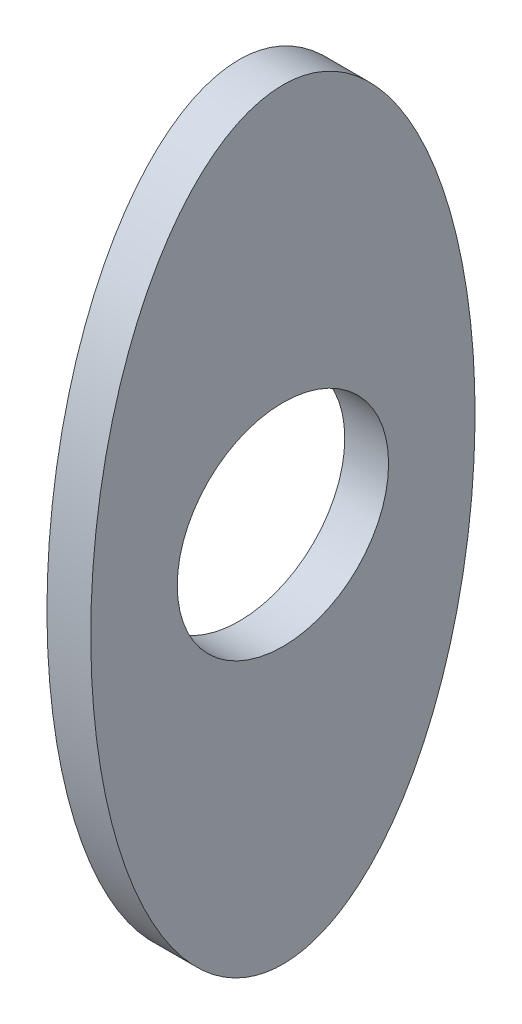
ISO-10303-21;
HEADER;
FILE_DESCRIPTION(('STEP AP214'),'2;1');
FILE_NAME('part.step','',(''),(''),'','','');
FILE_SCHEMA(('AUTOMOTIVE_DESIGN { 1 0 10303 214 1 1 1 1 }'));
ENDSEC;
DATA;
#1=APPLICATION_CONTEXT('core data for automotive mechanical design processes');
#2=APPLICATION_PROTOCOL_DEFINITION('international standard','automotive_design',2000,#1);
#3=PRODUCT_CONTEXT('',#1,'mechanical');
#4=PRODUCT('Part','Part','',(#3));
#5=PRODUCT_RELATED_PRODUCT_CATEGORY('part','',(#4));
#6=PRODUCT_DEFINITION_FORMATION('','',#4);
#7=PRODUCT_DEFINITION_CONTEXT('part definition',#1,'design');
#8=PRODUCT_DEFINITION('design','',#6,#7);
#9=PRODUCT_DEFINITION_SHAPE('','',#8);
#10=(LENGTH_UNIT() NAMED_UNIT(*) SI_UNIT(.MILLI.,.METRE.));
#11=(NAMED_UNIT(*) PLANE_ANGLE_UNIT() SI_UNIT($,.RADIAN.));
#12=(NAMED_UNIT(*) SI_UNIT($,.STERADIAN.) SOLID_ANGLE_UNIT());
#13=UNCERTAINTY_MEASURE_WITH_UNIT(LENGTH_MEASURE(1.E-05),#10,'distance_accuracy_value','');
#14=(GEOMETRIC_REPRESENTATION_CONTEXT(3) GLOBAL_UNCERTAINTY_ASSIGNED_CONTEXT((#13)) GLOBAL_UNIT_ASSIGNED_CONTEXT((#10,
#11,#12)) REPRESENTATION_CONTEXT('',''));
#15=CARTESIAN_POINT('',(0.,0.,0.));
#16=DIRECTION('',(0.,0.,1.));
#17=DIRECTION('',(1.,0.,0.));
#18=AXIS2_PLACEMENT_3D('',#15,#16,#17);
#19=CARTESIAN_POINT('',(2.76,4.62717328555032E-05,-2.56758528117259E-05));
#20=DIRECTION('',(1.,0.,0.));
#21=DIRECTION('',(0.,1.,0.));
#22=AXIS2_PLACEMENT_3D('',#19,#20,#21);
#23=ELLIPSE('',#22,21.9023873978996,11.0525434277011);
#24=DIRECTION('',(-1.,0.,0.));
#25=VECTOR('',#24,1.);
#26=SURFACE_OF_LINEAR_EXTRUSION('',#23,#25);
#27=CARTESIAN_POINT('',(2.76,21.9024336696325,-2.56758528117259E-05));
#28=VERTEX_POINT('',#27);
#29=EDGE_CURVE('E10',#28,#28,#23,.T.);
#30=ORIENTED_EDGE('',*,*,#29,.F.);
#31=EDGE_LOOP('',(#30));
#32=FACE_BOUND('',#31,.T.);
#33=CARTESIAN_POINT('',(0.24,4.62717328555032E-05,-2.56758528117259E-05));
#34=DIRECTION('',(1.,0.,0.));
#35=DIRECTION('',(0.,1.,0.));
#36=AXIS2_PLACEMENT_3D('',#33,#34,#35);
#37=ELLIPSE('',#36,21.9023873978996,11.0525434277011);
#38=CARTESIAN_POINT('',(0.24,21.9024336696325,-2.56758528117259E-05));
#39=VERTEX_POINT('',#38);
#40=EDGE_CURVE('E37',#39,#39,#37,.T.);
#41=ORIENTED_EDGE('',*,*,#40,.T.);
#42=EDGE_LOOP('',(#41));
#43=FACE_BOUND('',#42,.T.);
#44=ADVANCED_FACE('F33',(#32,#43),#26,.F.);
#45=CARTESIAN_POINT('',(2.76,4.62717328555032E-05,-2.56758528117259E-05));
#46=DIRECTION('',(1.,0.,0.));
#47=DIRECTION('',(0.,0.,-1.));
#48=AXIS2_PLACEMENT_3D('',#45,#46,#47);
#49=PLANE('',#48);
#50=CARTESIAN_POINT('',(2.76,4.62717328555032E-05,-2.56758528117259E-05));
#51=DIRECTION('',(1.,0.,0.));
#52=DIRECTION('',(0.,0.,-1.));
#53=AXIS2_PLACEMENT_3D('',#50,#51,#52);
#54=CIRCLE('',#53,6.07832908752004);
#55=CARTESIAN_POINT('',(2.76,4.62717328555032E-05,-6.07835476337285));
#56=VERTEX_POINT('',#55);
#57=EDGE_CURVE('E46',#56,#56,#54,.T.);
#58=ORIENTED_EDGE('',*,*,#57,.F.);
#59=EDGE_LOOP('',(#58));
#60=FACE_BOUND('',#59,.T.);
#61=ORIENTED_EDGE('',*,*,#29,.T.);
#62=EDGE_LOOP('',(#61));
#63=FACE_BOUND('',#62,.T.);
#64=ADVANCED_FACE('F61',(#60,#63),#49,.T.);
#65=CARTESIAN_POINT('',(0.24,4.62717328555032E-05,-2.56758528117259E-05));
#66=DIRECTION('',(1.,0.,0.));
#67=DIRECTION('',(0.,0.,-1.));
#68=AXIS2_PLACEMENT_3D('',#65,#66,#67);
#69=PLANE('',#68);
#70=CARTESIAN_POINT('',(0.24,4.62717328555032E-05,-2.56758528117259E-05));
#71=DIRECTION('',(1.,0.,0.));
#72=DIRECTION('',(0.,0.,-1.));
#73=AXIS2_PLACEMENT_3D('',#70,#71,#72);
#74=CIRCLE('',#73,6.07832908752004);
#75=CARTESIAN_POINT('',(0.24,4.62717328555032E-05,-6.07835476337285));
#76=VERTEX_POINT('',#75);
#77=EDGE_CURVE('E43',#76,#76,#74,.T.);
#78=ORIENTED_EDGE('',*,*,#77,.T.);
#79=EDGE_LOOP('',(#78));
#80=FACE_BOUND('',#79,.T.);
#81=ORIENTED_EDGE('',*,*,#40,.F.);
#82=EDGE_LOOP('',(#81));
#83=FACE_BOUND('',#82,.T.);
#84=ADVANCED_FACE('F52',(#80,#83),#69,.F.);
#85=CARTESIAN_POINT('',(0.24,4.62717328555032E-05,-2.56758528117259E-05));
#86=DIRECTION('',(1.,0.,0.));
#87=DIRECTION('',(0.,0.,-1.));
#88=AXIS2_PLACEMENT_3D('',#85,#86,#87);
#89=CYLINDRICAL_SURFACE('',#88,6.07832908752004);
#90=ORIENTED_EDGE('',*,*,#77,.F.);
#91=EDGE_LOOP('',(#90));
#92=FACE_BOUND('',#91,.T.);
#93=ORIENTED_EDGE('',*,*,#57,.T.);
#94=EDGE_LOOP('',(#93));
#95=FACE_BOUND('',#94,.T.);
#96=ADVANCED_FACE('F55',(#92,#95),#89,.F.);
#97=CLOSED_SHELL('',(#44,#64,#84,#96));
#98=MANIFOLD_SOLID_BREP('B2',#97);
#99=ADVANCED_BREP_SHAPE_REPRESENTATION('',(#18,#98),#14);
#100=SHAPE_DEFINITION_REPRESENTATION(#9,#99);
ENDSEC;
END-ISO-10303-21;
